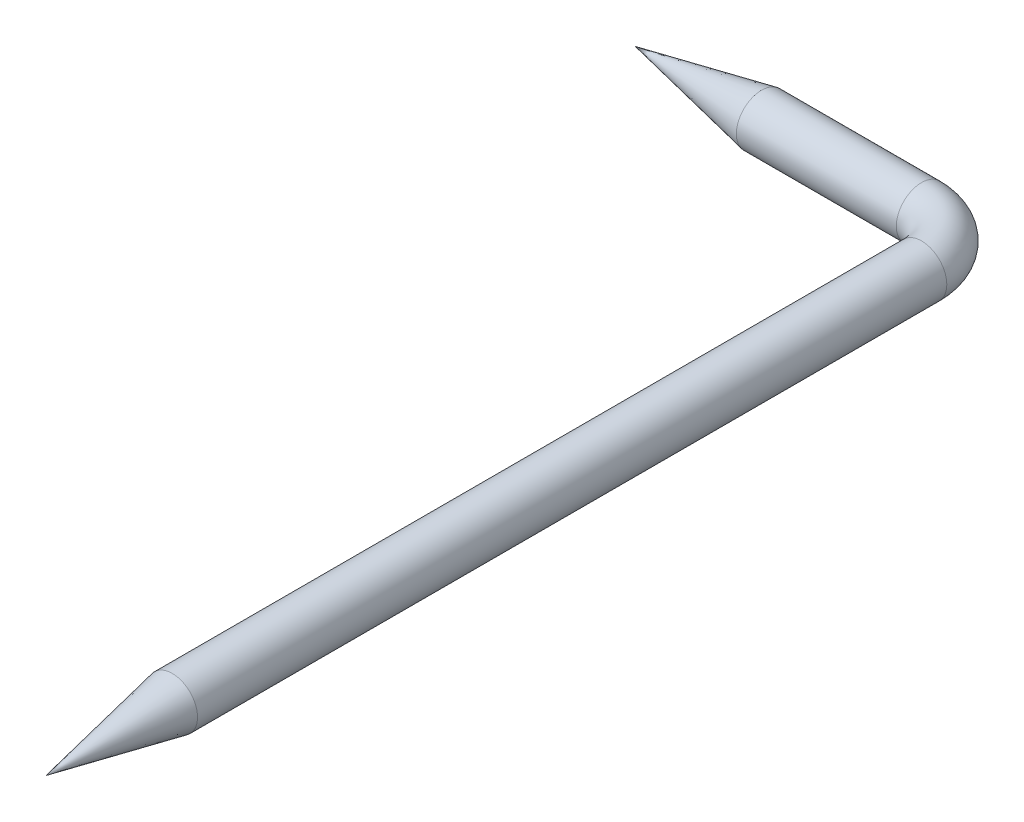
ISO-10303-21;
HEADER;
FILE_DESCRIPTION(('STEP AP214'),'2;1');
FILE_NAME('part.step','',(''),(''),'','','');
FILE_SCHEMA(('AUTOMOTIVE_DESIGN { 1 0 10303 214 1 1 1 1 }'));
ENDSEC;
DATA;
#1=APPLICATION_CONTEXT('core data for automotive mechanical design processes');
#2=APPLICATION_PROTOCOL_DEFINITION('international standard','automotive_design',2000,#1);
#3=PRODUCT_CONTEXT('',#1,'mechanical');
#4=PRODUCT('Part','Part','',(#3));
#5=PRODUCT_RELATED_PRODUCT_CATEGORY('part','',(#4));
#6=PRODUCT_DEFINITION_FORMATION('','',#4);
#7=PRODUCT_DEFINITION_CONTEXT('part definition',#1,'design');
#8=PRODUCT_DEFINITION('design','',#6,#7);
#9=PRODUCT_DEFINITION_SHAPE('','',#8);
#10=(LENGTH_UNIT() NAMED_UNIT(*) SI_UNIT(.MILLI.,.METRE.));
#11=(NAMED_UNIT(*) PLANE_ANGLE_UNIT() SI_UNIT($,.RADIAN.));
#12=(NAMED_UNIT(*) SI_UNIT($,.STERADIAN.) SOLID_ANGLE_UNIT());
#13=UNCERTAINTY_MEASURE_WITH_UNIT(LENGTH_MEASURE(1.E-05),#10,'distance_accuracy_value','');
#14=(GEOMETRIC_REPRESENTATION_CONTEXT(3) GLOBAL_UNCERTAINTY_ASSIGNED_CONTEXT((#13)) GLOBAL_UNIT_ASSIGNED_CONTEXT((#10,
#11,#12)) REPRESENTATION_CONTEXT('',''));
#15=CARTESIAN_POINT('',(0.,0.,0.));
#16=DIRECTION('',(0.,0.,1.));
#17=DIRECTION('',(1.,0.,0.));
#18=AXIS2_PLACEMENT_3D('',#15,#16,#17);
#19=CARTESIAN_POINT('',(0.,0.,0.));
#20=DIRECTION('',(1.,0.,0.));
#21=DIRECTION('',(0.,0.,-1.));
#22=AXIS2_PLACEMENT_3D('',#19,#20,#21);
#23=CYLINDRICAL_SURFACE('',#22,3.);
#24=CARTESIAN_POINT('',(19.,0.,0.));
#25=DIRECTION('',(1.,0.,0.));
#26=DIRECTION('',(0.,0.,-1.));
#27=AXIS2_PLACEMENT_3D('',#24,#25,#26);
#28=CIRCLE('',#27,3.);
#29=CARTESIAN_POINT('',(18.9999999999999,0.,-3.));
#30=VERTEX_POINT('',#29);
#31=EDGE_CURVE('E76',#30,#30,#28,.T.);
#32=ORIENTED_EDGE('',*,*,#31,.F.);
#33=EDGE_LOOP('',(#32));
#34=FACE_BOUND('',#33,.T.);
#35=CARTESIAN_POINT('',(0.,0.,0.));
#36=DIRECTION('',(1.,0.,0.));
#37=DIRECTION('',(0.,0.,-1.));
#38=AXIS2_PLACEMENT_3D('',#35,#36,#37);
#39=CIRCLE('',#38,3.);
#40=CARTESIAN_POINT('',(0.,0.,-3.));
#41=VERTEX_POINT('',#40);
#42=EDGE_CURVE('E79',#41,#41,#39,.T.);
#43=ORIENTED_EDGE('',*,*,#42,.T.);
#44=EDGE_LOOP('',(#43));
#45=FACE_BOUND('',#44,.T.);
#46=ADVANCED_FACE('F39',(#34,#45),#23,.T.);
#47=CARTESIAN_POINT('',(19.,0.,6.));
#48=DIRECTION('',(0.,-1.,0.));
#49=DIRECTION('',(0.,0.,-1.));
#50=AXIS2_PLACEMENT_3D('',#47,#48,#49);
#51=TOROIDAL_SURFACE('',#50,6.,3.);
#52=CARTESIAN_POINT('',(25.,0.,6.00000000000004));
#53=DIRECTION('',(0.,0.,1.));
#54=DIRECTION('',(1.,0.,0.));
#55=AXIS2_PLACEMENT_3D('',#52,#53,#54);
#56=CIRCLE('',#55,3.);
#57=CARTESIAN_POINT('',(28.,0.,6.00000000000006));
#58=VERTEX_POINT('',#57);
#59=EDGE_CURVE('E48',#58,#58,#56,.T.);
#60=CARTESIAN_POINT('',(19.,0.,6.));
#61=DIRECTION('',(0.,-1.,0.));
#62=DIRECTION('',(0.,0.,-1.));
#63=AXIS2_PLACEMENT_3D('',#60,#61,#62);
#64=CIRCLE('',#63,9.);
#65=EDGE_CURVE('',#30,#58,#64,.T.);
#66=ORIENTED_EDGE('',*,*,#31,.T.);
#67=ORIENTED_EDGE('',*,*,#59,.F.);
#68=ORIENTED_EDGE('',*,*,#65,.T.);
#69=ORIENTED_EDGE('',*,*,#65,.F.);
#70=EDGE_LOOP('',(#66,#68,#67,#69));
#71=FACE_BOUND('',#70,.T.);
#72=ADVANCED_FACE('F65',(#71),#51,.T.);
#73=CARTESIAN_POINT('',(25.,0.,6.00000000000004));
#74=DIRECTION('',(0.,0.,1.));
#75=DIRECTION('',(1.,0.,0.));
#76=AXIS2_PLACEMENT_3D('',#73,#74,#75);
#77=CYLINDRICAL_SURFACE('',#76,3.);
#78=CARTESIAN_POINT('',(25.,0.,95.));
#79=DIRECTION('',(0.,0.,1.));
#80=DIRECTION('',(1.,0.,0.));
#81=AXIS2_PLACEMENT_3D('',#78,#79,#80);
#82=CIRCLE('',#81,3.);
#83=CARTESIAN_POINT('',(28.,0.,95.));
#84=VERTEX_POINT('',#83);
#85=EDGE_CURVE('E11',#84,#84,#82,.T.);
#86=ORIENTED_EDGE('',*,*,#85,.F.);
#87=EDGE_LOOP('',(#86));
#88=FACE_BOUND('',#87,.T.);
#89=ORIENTED_EDGE('',*,*,#59,.T.);
#90=EDGE_LOOP('',(#89));
#91=FACE_BOUND('',#90,.T.);
#92=ADVANCED_FACE('F41',(#88,#91),#77,.T.);
#93=CARTESIAN_POINT('',(-15.,0.,0.));
#94=DIRECTION('',(1.,0.,0.));
#95=DIRECTION('',(0.,0.,-1.));
#96=AXIS2_PLACEMENT_3D('',#93,#94,#95);
#97=CONICAL_SURFACE('',#96,0.,0.197395559849881);
#98=ORIENTED_EDGE('',*,*,#42,.F.);
#99=EDGE_LOOP('',(#98));
#100=FACE_BOUND('',#99,.T.);
#101=CARTESIAN_POINT('',(-15.,0.,0.));
#102=VERTEX_POINT('',#101);
#103=VERTEX_LOOP('',#102);
#104=FACE_BOUND('',#103,.T.);
#105=ADVANCED_FACE('F56',(#100,#104),#97,.T.);
#106=CARTESIAN_POINT('',(25.,0.,110.));
#107=DIRECTION('',(0.,0.,-1.));
#108=DIRECTION('',(-1.,0.,0.));
#109=AXIS2_PLACEMENT_3D('',#106,#107,#108);
#110=CONICAL_SURFACE('',#109,0.,0.197395559849881);
#111=ORIENTED_EDGE('',*,*,#85,.T.);
#112=EDGE_LOOP('',(#111));
#113=FACE_BOUND('',#112,.T.);
#114=CARTESIAN_POINT('',(25.,0.,110.));
#115=VERTEX_POINT('',#114);
#116=VERTEX_LOOP('',#115);
#117=FACE_BOUND('',#116,.T.);
#118=ADVANCED_FACE('F54',(#113,#117),#110,.T.);
#119=CLOSED_SHELL('',(#46,#72,#92,#105,#118));
#120=MANIFOLD_SOLID_BREP('B2',#119);
#121=ADVANCED_BREP_SHAPE_REPRESENTATION('',(#18,#120),#14);
#122=SHAPE_DEFINITION_REPRESENTATION(#9,#121);
ENDSEC;
END-ISO-10303-21;
